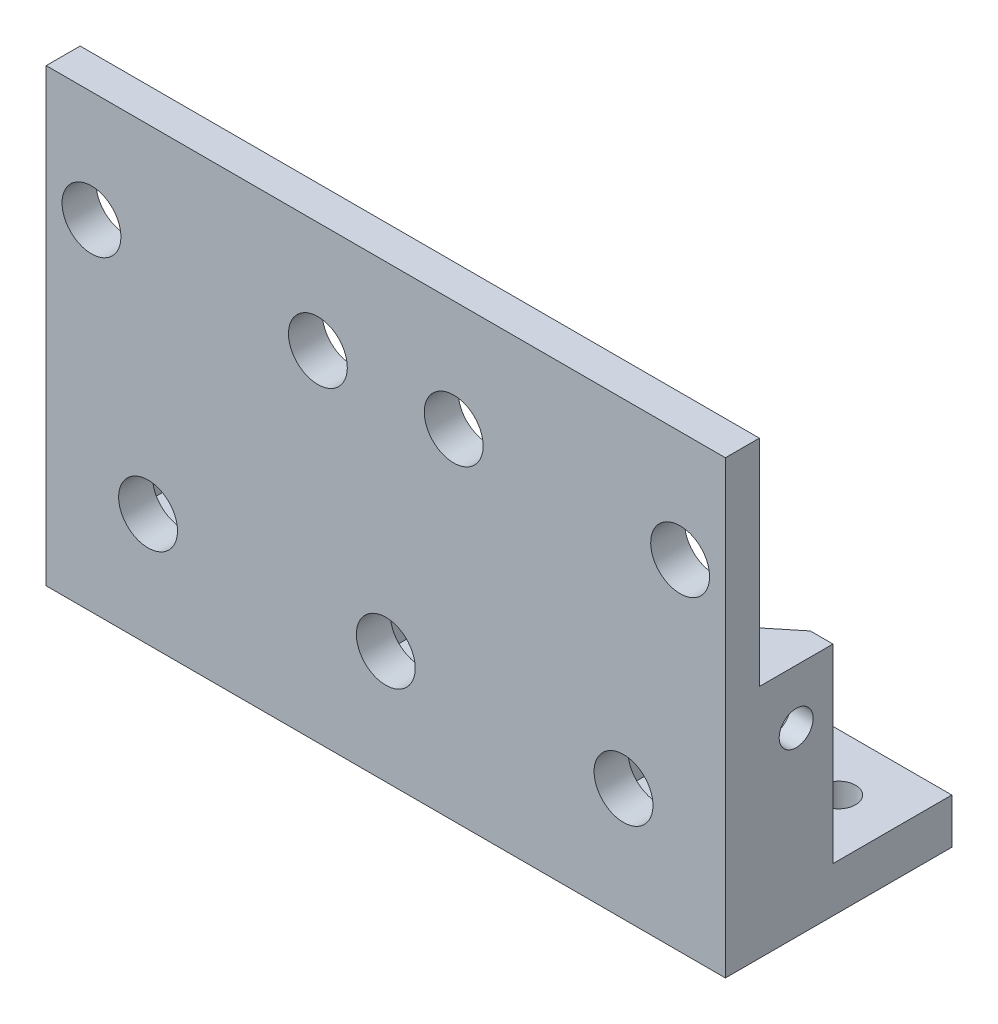
ISO-10303-21;
HEADER;
FILE_DESCRIPTION(('STEP AP214'),'2;1');
FILE_NAME('part.step','',(''),(''),'','','');
FILE_SCHEMA(('AUTOMOTIVE_DESIGN { 1 0 10303 214 1 1 1 1 }'));
ENDSEC;
DATA;
#1=APPLICATION_CONTEXT('core data for automotive mechanical design processes');
#2=APPLICATION_PROTOCOL_DEFINITION('international standard','automotive_design',2000,#1);
#3=PRODUCT_CONTEXT('',#1,'mechanical');
#4=PRODUCT('Part','Part','',(#3));
#5=PRODUCT_RELATED_PRODUCT_CATEGORY('part','',(#4));
#6=PRODUCT_DEFINITION_FORMATION('','',#4);
#7=PRODUCT_DEFINITION_CONTEXT('part definition',#1,'design');
#8=PRODUCT_DEFINITION('design','',#6,#7);
#9=PRODUCT_DEFINITION_SHAPE('','',#8);
#10=(LENGTH_UNIT() NAMED_UNIT(*) SI_UNIT(.MILLI.,.METRE.));
#11=(NAMED_UNIT(*) PLANE_ANGLE_UNIT() SI_UNIT($,.RADIAN.));
#12=(NAMED_UNIT(*) SI_UNIT($,.STERADIAN.) SOLID_ANGLE_UNIT());
#13=UNCERTAINTY_MEASURE_WITH_UNIT(LENGTH_MEASURE(1.E-05),#10,'distance_accuracy_value','');
#14=(GEOMETRIC_REPRESENTATION_CONTEXT(3) GLOBAL_UNCERTAINTY_ASSIGNED_CONTEXT((#13)) GLOBAL_UNIT_ASSIGNED_CONTEXT((#10,
#11,#12)) REPRESENTATION_CONTEXT('',''));
#15=CARTESIAN_POINT('',(0.,0.,0.));
#16=DIRECTION('',(0.,0.,1.));
#17=DIRECTION('',(1.,0.,0.));
#18=AXIS2_PLACEMENT_3D('',#15,#16,#17);
#19=CARTESIAN_POINT('',(60.,19.9,-1.5));
#20=DIRECTION('',(0.,0.,1.));
#21=DIRECTION('',(0.,-1.,0.));
#22=AXIS2_PLACEMENT_3D('',#19,#20,#21);
#23=PLANE('',#22);
#24=CARTESIAN_POINT('',(9.,-9.89999999999999,-1.5));
#25=DIRECTION('',(0.,0.,-1.));
#26=DIRECTION('',(0.,1.,0.));
#27=AXIS2_PLACEMENT_3D('',#24,#25,#26);
#28=CIRCLE('',#27,2.60000000000001);
#29=CARTESIAN_POINT('',(9.,-7.29999999999998,-1.5));
#30=VERTEX_POINT('',#29);
#31=EDGE_CURVE('E333',#30,#30,#28,.T.);
#32=ORIENTED_EDGE('',*,*,#31,.F.);
#33=EDGE_LOOP('',(#32));
#34=FACE_BOUND('',#33,.T.);
#35=CARTESIAN_POINT('',(30.,-9.89999999999999,-1.5));
#36=DIRECTION('',(0.,0.,-1.));
#37=DIRECTION('',(0.,1.,0.));
#38=AXIS2_PLACEMENT_3D('',#35,#36,#37);
#39=CIRCLE('',#38,2.60000000000001);
#40=CARTESIAN_POINT('',(30.,-7.29999999999998,-1.5));
#41=VERTEX_POINT('',#40);
#42=EDGE_CURVE('E327',#41,#41,#39,.T.);
#43=ORIENTED_EDGE('',*,*,#42,.F.);
#44=EDGE_LOOP('',(#43));
#45=FACE_BOUND('',#44,.T.);
#46=CARTESIAN_POINT('',(51.,-9.89999999999999,-1.5));
#47=DIRECTION('',(0.,0.,-1.));
#48=DIRECTION('',(0.,1.,0.));
#49=AXIS2_PLACEMENT_3D('',#46,#47,#48);
#50=CIRCLE('',#49,2.60000000000001);
#51=CARTESIAN_POINT('',(51.,-7.29999999999998,-1.5));
#52=VERTEX_POINT('',#51);
#53=EDGE_CURVE('E321',#52,#52,#50,.T.);
#54=ORIENTED_EDGE('',*,*,#53,.F.);
#55=EDGE_LOOP('',(#54));
#56=FACE_BOUND('',#55,.T.);
#57=CARTESIAN_POINT('',(4.,10.1,-1.5));
#58=DIRECTION('',(0.,0.,-1.));
#59=DIRECTION('',(0.,1.,0.));
#60=AXIS2_PLACEMENT_3D('',#57,#58,#59);
#61=CIRCLE('',#60,2.60000000000001);
#62=CARTESIAN_POINT('',(4.,12.7,-1.5));
#63=VERTEX_POINT('',#62);
#64=EDGE_CURVE('E256',#63,#63,#61,.T.);
#65=ORIENTED_EDGE('',*,*,#64,.F.);
#66=EDGE_LOOP('',(#65));
#67=FACE_BOUND('',#66,.T.);
#68=CARTESIAN_POINT('',(24.,10.1,-1.5));
#69=DIRECTION('',(0.,0.,-1.));
#70=DIRECTION('',(0.,1.,0.));
#71=AXIS2_PLACEMENT_3D('',#68,#69,#70);
#72=CIRCLE('',#71,2.60000000000001);
#73=CARTESIAN_POINT('',(24.,12.7,-1.5));
#74=VERTEX_POINT('',#73);
#75=EDGE_CURVE('E250',#74,#74,#72,.T.);
#76=ORIENTED_EDGE('',*,*,#75,.F.);
#77=EDGE_LOOP('',(#76));
#78=FACE_BOUND('',#77,.T.);
#79=CARTESIAN_POINT('',(36.,10.1,-1.5));
#80=DIRECTION('',(0.,0.,-1.));
#81=DIRECTION('',(0.,1.,0.));
#82=AXIS2_PLACEMENT_3D('',#79,#80,#81);
#83=CIRCLE('',#82,2.60000000000001);
#84=CARTESIAN_POINT('',(36.,12.7,-1.5));
#85=VERTEX_POINT('',#84);
#86=EDGE_CURVE('E244',#85,#85,#83,.T.);
#87=ORIENTED_EDGE('',*,*,#86,.F.);
#88=EDGE_LOOP('',(#87));
#89=FACE_BOUND('',#88,.T.);
#90=CARTESIAN_POINT('',(56.,10.1,-1.5));
#91=DIRECTION('',(0.,0.,-1.));
#92=DIRECTION('',(0.,1.,0.));
#93=AXIS2_PLACEMENT_3D('',#90,#91,#92);
#94=CIRCLE('',#93,2.60000000000001);
#95=CARTESIAN_POINT('',(56.,12.7,-1.5));
#96=VERTEX_POINT('',#95);
#97=EDGE_CURVE('E238',#96,#96,#94,.T.);
#98=ORIENTED_EDGE('',*,*,#97,.F.);
#99=EDGE_LOOP('',(#98));
#100=FACE_BOUND('',#99,.T.);
#101=DIRECTION('',(0.,1.,0.));
#102=VECTOR('',#101,1.);
#103=CARTESIAN_POINT('',(60.,19.9,-1.5));
#104=LINE('',#103,#102);
#105=CARTESIAN_POINT('',(60.,0.900000000000005,-1.5));
#106=VERTEX_POINT('',#105);
#107=CARTESIAN_POINT('',(60.,19.9,-1.5));
#108=VERTEX_POINT('',#107);
#109=EDGE_CURVE('E395',#106,#108,#104,.T.);
#110=ORIENTED_EDGE('',*,*,#109,.F.);
#111=DIRECTION('',(-1.,0.,0.));
#112=VECTOR('',#111,1.);
#113=CARTESIAN_POINT('',(50.,0.900000000000005,-1.49999999999999));
#114=LINE('',#113,#112);
#115=CARTESIAN_POINT('',(50.,0.900000000000005,-1.49999999999999));
#116=VERTEX_POINT('',#115);
#117=EDGE_CURVE('E203',#106,#116,#114,.T.);
#118=ORIENTED_EDGE('',*,*,#117,.T.);
#119=DIRECTION('',(0.,-1.,0.));
#120=VECTOR('',#119,1.);
#121=CARTESIAN_POINT('',(50.,0.900000000000005,-1.49999999999999));
#122=LINE('',#121,#120);
#123=CARTESIAN_POINT('',(50.,-0.899999999999995,-1.49999999999999));
#124=VERTEX_POINT('',#123);
#125=EDGE_CURVE('E214',#116,#124,#122,.T.);
#126=ORIENTED_EDGE('',*,*,#125,.T.);
#127=DIRECTION('',(-1.,0.,0.));
#128=VECTOR('',#127,1.);
#129=CARTESIAN_POINT('',(60.,-0.899999999999995,-1.5));
#130=LINE('',#129,#128);
#131=CARTESIAN_POINT('',(58.,-0.899999999999995,-1.5));
#132=VERTEX_POINT('',#131);
#133=EDGE_CURVE('E204',#132,#124,#130,.T.);
#134=ORIENTED_EDGE('',*,*,#133,.F.);
#135=DIRECTION('',(0.,1.,0.));
#136=VECTOR('',#135,1.);
#137=CARTESIAN_POINT('',(58.,-0.899999999999994,-1.5));
#138=LINE('',#137,#136);
#139=CARTESIAN_POINT('',(58.,-15.9,-1.5));
#140=VERTEX_POINT('',#139);
#141=EDGE_CURVE('E55',#140,#132,#138,.T.);
#142=ORIENTED_EDGE('',*,*,#141,.F.);
#143=DIRECTION('',(-1.,0.,0.));
#144=VECTOR('',#143,1.);
#145=CARTESIAN_POINT('',(60.,-15.9,-1.5));
#146=LINE('',#145,#144);
#147=CARTESIAN_POINT('',(45.,-15.9,-1.5));
#148=VERTEX_POINT('',#147);
#149=EDGE_CURVE('E341',#140,#148,#146,.T.);
#150=ORIENTED_EDGE('',*,*,#149,.T.);
#151=DIRECTION('',(0.,-1.,0.));
#152=VECTOR('',#151,1.);
#153=CARTESIAN_POINT('',(45.,44.1,-1.5));
#154=LINE('',#153,#152);
#155=CARTESIAN_POINT('',(45.,-0.100000000000003,-1.5));
#156=VERTEX_POINT('',#155);
#157=EDGE_CURVE('E346',#156,#148,#154,.T.);
#158=ORIENTED_EDGE('',*,*,#157,.F.);
#159=DIRECTION('',(-1.,0.,0.));
#160=VECTOR('',#159,1.);
#161=CARTESIAN_POINT('',(60.,-0.100000000000003,-1.5));
#162=LINE('',#161,#160);
#163=CARTESIAN_POINT('',(36.,-0.100000000000003,-1.5));
#164=VERTEX_POINT('',#163);
#165=EDGE_CURVE('E423',#156,#164,#162,.T.);
#166=ORIENTED_EDGE('',*,*,#165,.T.);
#167=DIRECTION('',(0.,-1.,0.));
#168=VECTOR('',#167,1.);
#169=CARTESIAN_POINT('',(36.,44.1,-1.5));
#170=LINE('',#169,#168);
#171=CARTESIAN_POINT('',(36.,-15.9,-1.5));
#172=VERTEX_POINT('',#171);
#173=EDGE_CURVE('E363',#164,#172,#170,.T.);
#174=ORIENTED_EDGE('',*,*,#173,.T.);
#175=DIRECTION('',(-1.,0.,0.));
#176=VECTOR('',#175,1.);
#177=CARTESIAN_POINT('',(36.,-15.9,-1.5));
#178=LINE('',#177,#176);
#179=CARTESIAN_POINT('',(24.,-15.9,-1.5));
#180=VERTEX_POINT('',#179);
#181=EDGE_CURVE('E365',#172,#180,#178,.T.);
#182=ORIENTED_EDGE('',*,*,#181,.T.);
#183=DIRECTION('',(0.,-1.,0.));
#184=VECTOR('',#183,1.);
#185=CARTESIAN_POINT('',(24.,44.1,-1.5));
#186=LINE('',#185,#184);
#187=CARTESIAN_POINT('',(24.,-0.100000000000003,-1.5));
#188=VERTEX_POINT('',#187);
#189=EDGE_CURVE('E339',#188,#180,#186,.T.);
#190=ORIENTED_EDGE('',*,*,#189,.F.);
#191=CARTESIAN_POINT('',(15.,-0.100000000000003,-1.5));
#192=VERTEX_POINT('',#191);
#193=EDGE_CURVE('E420',#188,#192,#162,.T.);
#194=ORIENTED_EDGE('',*,*,#193,.T.);
#195=DIRECTION('',(0.,-1.,0.));
#196=VECTOR('',#195,1.);
#197=CARTESIAN_POINT('',(15.,44.1,-1.5));
#198=LINE('',#197,#196);
#199=CARTESIAN_POINT('',(15.,-15.9,-1.5));
#200=VERTEX_POINT('',#199);
#201=EDGE_CURVE('E350',#192,#200,#198,.T.);
#202=ORIENTED_EDGE('',*,*,#201,.T.);
#203=DIRECTION('',(-1.,0.,0.));
#204=VECTOR('',#203,1.);
#205=CARTESIAN_POINT('',(0.,-15.9,-1.5));
#206=LINE('',#205,#204);
#207=CARTESIAN_POINT('',(2.,-15.9,-1.5));
#208=VERTEX_POINT('',#207);
#209=EDGE_CURVE('E352',#200,#208,#206,.T.);
#210=ORIENTED_EDGE('',*,*,#209,.T.);
#211=DIRECTION('',(0.,1.,0.));
#212=VECTOR('',#211,1.);
#213=CARTESIAN_POINT('',(2.,-0.899999999999994,-1.5));
#214=LINE('',#213,#212);
#215=CARTESIAN_POINT('',(2.,-0.899999999999994,-1.5));
#216=VERTEX_POINT('',#215);
#217=EDGE_CURVE('E291',#208,#216,#214,.T.);
#218=ORIENTED_EDGE('',*,*,#217,.T.);
#219=DIRECTION('',(1.,0.,0.));
#220=VECTOR('',#219,1.);
#221=CARTESIAN_POINT('',(10.,-0.899999999999995,-1.49999999999999));
#222=LINE('',#221,#220);
#223=CARTESIAN_POINT('',(9.99999999999998,-0.899999999999995,-1.5));
#224=VERTEX_POINT('',#223);
#225=EDGE_CURVE('E262',#216,#224,#222,.T.);
#226=ORIENTED_EDGE('',*,*,#225,.T.);
#227=DIRECTION('',(0.,-1.,0.));
#228=VECTOR('',#227,1.);
#229=CARTESIAN_POINT('',(10.,0.900000000000005,-1.49999999999999));
#230=LINE('',#229,#228);
#231=CARTESIAN_POINT('',(9.99999999999998,0.900000000000005,-1.5));
#232=VERTEX_POINT('',#231);
#233=EDGE_CURVE('E281',#232,#224,#230,.T.);
#234=ORIENTED_EDGE('',*,*,#233,.F.);
#235=DIRECTION('',(1.,0.,0.));
#236=VECTOR('',#235,1.);
#237=CARTESIAN_POINT('',(0.,0.900000000000005,-1.5));
#238=LINE('',#237,#236);
#239=CARTESIAN_POINT('',(0.,0.900000000000005,-1.5));
#240=VERTEX_POINT('',#239);
#241=EDGE_CURVE('E266',#240,#232,#238,.T.);
#242=ORIENTED_EDGE('',*,*,#241,.F.);
#243=DIRECTION('',(0.,1.,0.));
#244=VECTOR('',#243,1.);
#245=CARTESIAN_POINT('',(0.,19.9,-1.5));
#246=LINE('',#245,#244);
#247=CARTESIAN_POINT('',(0.,19.9,-1.5));
#248=VERTEX_POINT('',#247);
#249=EDGE_CURVE('E405',#240,#248,#246,.T.);
#250=ORIENTED_EDGE('',*,*,#249,.T.);
#251=DIRECTION('',(-1.,0.,0.));
#252=VECTOR('',#251,1.);
#253=CARTESIAN_POINT('',(60.,19.9,-1.5));
#254=LINE('',#253,#252);
#255=EDGE_CURVE('E417',#108,#248,#254,.T.);
#256=ORIENTED_EDGE('',*,*,#255,.F.);
#257=EDGE_LOOP('',(#110,#118,#126,#134,#142,#150,#158,#166,#174,#182,#190,#194,#202,#210,#218,
#226,#234,#242,#250,#256));
#258=FACE_BOUND('',#257,.T.);
#259=ADVANCED_FACE('F39',(#34,#45,#56,#67,#78,#89,#100,#258),#23,.F.);
#260=CARTESIAN_POINT('',(0.,-15.9,0.));
#261=DIRECTION('',(0.,-1.,0.));
#262=DIRECTION('',(0.,0.,-1.));
#263=AXIS2_PLACEMENT_3D('',#260,#261,#262);
#264=PLANE('',#263);
#265=CARTESIAN_POINT('',(55.,-15.9,-13.5));
#266=DIRECTION('',(0.,-1.,0.));
#267=DIRECTION('',(0.,0.,-1.));
#268=AXIS2_PLACEMENT_3D('',#265,#266,#267);
#269=CIRCLE('',#268,1.50000000000001);
#270=CARTESIAN_POINT('',(55.,-15.9,-15.));
#271=VERTEX_POINT('',#270);
#272=EDGE_CURVE('E309',#271,#271,#269,.T.);
#273=ORIENTED_EDGE('',*,*,#272,.T.);
#274=EDGE_LOOP('',(#273));
#275=FACE_BOUND('',#274,.T.);
#276=DIRECTION('',(0.,0.,1.));
#277=VECTOR('',#276,1.);
#278=CARTESIAN_POINT('',(58.,-15.9,-8.));
#279=LINE('',#278,#277);
#280=CARTESIAN_POINT('',(58.,-15.9,-8.));
#281=VERTEX_POINT('',#280);
#282=EDGE_CURVE('E228',#281,#140,#279,.T.);
#283=ORIENTED_EDGE('',*,*,#282,.F.);
#284=DIRECTION('',(1.,0.,0.));
#285=VECTOR('',#284,1.);
#286=CARTESIAN_POINT('',(58.,-15.9,-8.));
#287=LINE('',#286,#285);
#288=CARTESIAN_POINT('',(60.,-15.9,-8.));
#289=VERTEX_POINT('',#288);
#290=EDGE_CURVE('E63',#281,#289,#287,.T.);
#291=ORIENTED_EDGE('',*,*,#290,.T.);
#292=DIRECTION('',(0.,0.,1.));
#293=VECTOR('',#292,1.);
#294=CARTESIAN_POINT('',(60.,-15.9,-18.5));
#295=LINE('',#294,#293);
#296=CARTESIAN_POINT('',(60.,-15.9,-18.5));
#297=VERTEX_POINT('',#296);
#298=EDGE_CURVE('E191',#297,#289,#295,.T.);
#299=ORIENTED_EDGE('',*,*,#298,.F.);
#300=DIRECTION('',(-1.,0.,0.));
#301=VECTOR('',#300,1.);
#302=CARTESIAN_POINT('',(60.,-15.9,-18.5));
#303=LINE('',#302,#301);
#304=CARTESIAN_POINT('',(45.,-15.9,-18.5));
#305=VERTEX_POINT('',#304);
#306=EDGE_CURVE('E48',#297,#305,#303,.T.);
#307=ORIENTED_EDGE('',*,*,#306,.T.);
#308=DIRECTION('',(0.,0.,-1.));
#309=VECTOR('',#308,1.);
#310=CARTESIAN_POINT('',(45.,-15.9,-18.5));
#311=LINE('',#310,#309);
#312=EDGE_CURVE('E344',#148,#305,#311,.T.);
#313=ORIENTED_EDGE('',*,*,#312,.F.);
#314=ORIENTED_EDGE('',*,*,#149,.F.);
#315=EDGE_LOOP('',(#283,#291,#299,#307,#313,#314));
#316=FACE_BOUND('',#315,.T.);
#317=ADVANCED_FACE('F500',(#275,#316),#264,.F.);
#318=CARTESIAN_POINT('',(60.,-15.9,-18.5));
#319=DIRECTION('',(0.,-0.732486492845499,0.680781563938758));
#320=DIRECTION('',(0.,-0.680781563938758,-0.732486492845499));
#321=AXIS2_PLACEMENT_3D('',#318,#319,#320);
#322=PLANE('',#321);
#323=CARTESIAN_POINT('',(24.,-15.9,-18.5));
#324=VERTEX_POINT('',#323);
#325=CARTESIAN_POINT('',(15.,-15.9,-18.5));
#326=VERTEX_POINT('',#325);
#327=EDGE_CURVE('E426',#324,#326,#303,.T.);
#328=ORIENTED_EDGE('',*,*,#327,.T.);
#329=DIRECTION('',(0.,0.680781563938758,0.732486492845499));
#330=VECTOR('',#329,1.);
#331=CARTESIAN_POINT('',(15.,-15.9,-18.5));
#332=LINE('',#331,#330);
#333=EDGE_CURVE('E382',#326,#192,#332,.T.);
#334=ORIENTED_EDGE('',*,*,#333,.T.);
#335=ORIENTED_EDGE('',*,*,#193,.F.);
#336=DIRECTION('',(0.,-0.680781563938758,-0.732486492845499));
#337=VECTOR('',#336,1.);
#338=CARTESIAN_POINT('',(24.,-15.9,-18.5));
#339=LINE('',#338,#337);
#340=EDGE_CURVE('E379',#188,#324,#339,.T.);
#341=ORIENTED_EDGE('',*,*,#340,.T.);
#342=EDGE_LOOP('',(#328,#334,#335,#341));
#343=FACE_BOUND('',#342,.T.);
#344=ADVANCED_FACE('F451',(#343),#322,.F.);
#345=CARTESIAN_POINT('',(60.,-19.9,-18.5));
#346=DIRECTION('',(0.,0.,1.));
#347=DIRECTION('',(1.,0.,0.));
#348=AXIS2_PLACEMENT_3D('',#345,#346,#347);
#349=PLANE('',#348);
#350=DIRECTION('',(0.,1.,0.));
#351=VECTOR('',#350,1.);
#352=CARTESIAN_POINT('',(0.,-19.9,-18.5));
#353=LINE('',#352,#351);
#354=CARTESIAN_POINT('',(0.,-19.9,-18.5));
#355=VERTEX_POINT('',#354);
#356=CARTESIAN_POINT('',(0.,-15.9,-18.5));
#357=VERTEX_POINT('',#356);
#358=EDGE_CURVE('E388',#355,#357,#353,.T.);
#359=ORIENTED_EDGE('',*,*,#358,.T.);
#360=DIRECTION('',(1.,0.,0.));
#361=VECTOR('',#360,1.);
#362=CARTESIAN_POINT('',(0.,-15.9,-18.5));
#363=LINE('',#362,#361);
#364=EDGE_CURVE('E359',#357,#326,#363,.T.);
#365=ORIENTED_EDGE('',*,*,#364,.T.);
#366=ORIENTED_EDGE('',*,*,#327,.F.);
#367=DIRECTION('',(1.,0.,0.));
#368=VECTOR('',#367,1.);
#369=CARTESIAN_POINT('',(36.,-15.9,-18.5));
#370=LINE('',#369,#368);
#371=CARTESIAN_POINT('',(36.,-15.9,-18.5));
#372=VERTEX_POINT('',#371);
#373=EDGE_CURVE('E372',#324,#372,#370,.T.);
#374=ORIENTED_EDGE('',*,*,#373,.T.);
#375=EDGE_CURVE('E425',#305,#372,#303,.T.);
#376=ORIENTED_EDGE('',*,*,#375,.F.);
#377=ORIENTED_EDGE('',*,*,#306,.F.);
#378=DIRECTION('',(0.,1.,0.));
#379=VECTOR('',#378,1.);
#380=CARTESIAN_POINT('',(60.,-19.9,-18.5));
#381=LINE('',#380,#379);
#382=CARTESIAN_POINT('',(60.,-19.9,-18.5));
#383=VERTEX_POINT('',#382);
#384=EDGE_CURVE('E392',#383,#297,#381,.T.);
#385=ORIENTED_EDGE('',*,*,#384,.F.);
#386=DIRECTION('',(-1.,0.,0.));
#387=VECTOR('',#386,1.);
#388=CARTESIAN_POINT('',(60.,-19.9,-18.5));
#389=LINE('',#388,#387);
#390=EDGE_CURVE('E11',#383,#355,#389,.T.);
#391=ORIENTED_EDGE('',*,*,#390,.T.);
#392=EDGE_LOOP('',(#359,#365,#366,#374,#376,#377,#385,#391));
#393=FACE_BOUND('',#392,.T.);
#394=ADVANCED_FACE('F41',(#393),#349,.F.);
#395=ORIENTED_EDGE('',*,*,#165,.F.);
#396=DIRECTION('',(0.,-0.680781563938758,-0.732486492845499));
#397=VECTOR('',#396,1.);
#398=CARTESIAN_POINT('',(45.,-15.9,-18.5));
#399=LINE('',#398,#397);
#400=EDGE_CURVE('E385',#156,#305,#399,.T.);
#401=ORIENTED_EDGE('',*,*,#400,.T.);
#402=ORIENTED_EDGE('',*,*,#375,.T.);
#403=DIRECTION('',(0.,0.680781563938758,0.732486492845499));
#404=VECTOR('',#403,1.);
#405=CARTESIAN_POINT('',(36.,-15.9,-18.5));
#406=LINE('',#405,#404);
#407=EDGE_CURVE('E349',#372,#164,#406,.T.);
#408=ORIENTED_EDGE('',*,*,#407,.T.);
#409=EDGE_LOOP('',(#395,#401,#402,#408));
#410=FACE_BOUND('',#409,.T.);
#411=ADVANCED_FACE('F437',(#410),#322,.F.);
#412=CARTESIAN_POINT('',(60.,19.9,1.5));
#413=DIRECTION('',(0.,-1.,0.));
#414=DIRECTION('',(0.,0.,-1.));
#415=AXIS2_PLACEMENT_3D('',#412,#413,#414);
#416=PLANE('',#415);
#417=DIRECTION('',(0.,0.,1.));
#418=VECTOR('',#417,1.);
#419=CARTESIAN_POINT('',(0.,19.9,1.5));
#420=LINE('',#419,#418);
#421=CARTESIAN_POINT('',(0.,19.9,1.5));
#422=VERTEX_POINT('',#421);
#423=EDGE_CURVE('E407',#248,#422,#420,.T.);
#424=ORIENTED_EDGE('',*,*,#423,.T.);
#425=DIRECTION('',(-1.,0.,0.));
#426=VECTOR('',#425,1.);
#427=CARTESIAN_POINT('',(60.,19.9,1.5));
#428=LINE('',#427,#426);
#429=CARTESIAN_POINT('',(60.,19.9,1.5));
#430=VERTEX_POINT('',#429);
#431=EDGE_CURVE('E414',#430,#422,#428,.T.);
#432=ORIENTED_EDGE('',*,*,#431,.F.);
#433=DIRECTION('',(0.,0.,1.));
#434=VECTOR('',#433,1.);
#435=CARTESIAN_POINT('',(60.,19.9,1.5));
#436=LINE('',#435,#434);
#437=EDGE_CURVE('E397',#108,#430,#436,.T.);
#438=ORIENTED_EDGE('',*,*,#437,.F.);
#439=ORIENTED_EDGE('',*,*,#255,.T.);
#440=EDGE_LOOP('',(#424,#432,#438,#439));
#441=FACE_BOUND('',#440,.T.);
#442=ADVANCED_FACE('F488',(#441),#416,.F.);
#443=CARTESIAN_POINT('',(60.,19.9,1.5));
#444=DIRECTION('',(0.,0.,-1.));
#445=DIRECTION('',(0.,1.,0.));
#446=AXIS2_PLACEMENT_3D('',#443,#444,#445);
#447=PLANE('',#446);
#448=CARTESIAN_POINT('',(56.,10.1,1.5));
#449=DIRECTION('',(0.,0.,-1.));
#450=DIRECTION('',(0.,1.,0.));
#451=AXIS2_PLACEMENT_3D('',#448,#449,#450);
#452=CIRCLE('',#451,2.60000000000001);
#453=CARTESIAN_POINT('',(56.,12.7,1.5));
#454=VERTEX_POINT('',#453);
#455=EDGE_CURVE('E241',#454,#454,#452,.T.);
#456=ORIENTED_EDGE('',*,*,#455,.T.);
#457=EDGE_LOOP('',(#456));
#458=FACE_BOUND('',#457,.T.);
#459=CARTESIAN_POINT('',(36.,10.1,1.5));
#460=DIRECTION('',(0.,0.,-1.));
#461=DIRECTION('',(0.,1.,0.));
#462=AXIS2_PLACEMENT_3D('',#459,#460,#461);
#463=CIRCLE('',#462,2.60000000000001);
#464=CARTESIAN_POINT('',(36.,12.7,1.5));
#465=VERTEX_POINT('',#464);
#466=EDGE_CURVE('E247',#465,#465,#463,.T.);
#467=ORIENTED_EDGE('',*,*,#466,.T.);
#468=EDGE_LOOP('',(#467));
#469=FACE_BOUND('',#468,.T.);
#470=CARTESIAN_POINT('',(24.,10.1,1.5));
#471=DIRECTION('',(0.,0.,-1.));
#472=DIRECTION('',(0.,1.,0.));
#473=AXIS2_PLACEMENT_3D('',#470,#471,#472);
#474=CIRCLE('',#473,2.60000000000001);
#475=CARTESIAN_POINT('',(24.,12.7,1.5));
#476=VERTEX_POINT('',#475);
#477=EDGE_CURVE('E253',#476,#476,#474,.T.);
#478=ORIENTED_EDGE('',*,*,#477,.T.);
#479=EDGE_LOOP('',(#478));
#480=FACE_BOUND('',#479,.T.);
#481=CARTESIAN_POINT('',(4.,10.1,1.5));
#482=DIRECTION('',(0.,0.,-1.));
#483=DIRECTION('',(0.,1.,0.));
#484=AXIS2_PLACEMENT_3D('',#481,#482,#483);
#485=CIRCLE('',#484,2.60000000000001);
#486=CARTESIAN_POINT('',(4.,12.7,1.5));
#487=VERTEX_POINT('',#486);
#488=EDGE_CURVE('E259',#487,#487,#485,.T.);
#489=ORIENTED_EDGE('',*,*,#488,.T.);
#490=EDGE_LOOP('',(#489));
#491=FACE_BOUND('',#490,.T.);
#492=CARTESIAN_POINT('',(51.,-9.89999999999999,1.5));
#493=DIRECTION('',(0.,0.,-1.));
#494=DIRECTION('',(0.,1.,0.));
#495=AXIS2_PLACEMENT_3D('',#492,#493,#494);
#496=CIRCLE('',#495,2.60000000000001);
#497=CARTESIAN_POINT('',(51.,-7.29999999999998,1.5));
#498=VERTEX_POINT('',#497);
#499=EDGE_CURVE('E324',#498,#498,#496,.T.);
#500=ORIENTED_EDGE('',*,*,#499,.T.);
#501=EDGE_LOOP('',(#500));
#502=FACE_BOUND('',#501,.T.);
#503=CARTESIAN_POINT('',(30.,-9.89999999999999,1.5));
#504=DIRECTION('',(0.,0.,-1.));
#505=DIRECTION('',(0.,1.,0.));
#506=AXIS2_PLACEMENT_3D('',#503,#504,#505);
#507=CIRCLE('',#506,2.60000000000001);
#508=CARTESIAN_POINT('',(30.,-7.29999999999998,1.5));
#509=VERTEX_POINT('',#508);
#510=EDGE_CURVE('E330',#509,#509,#507,.T.);
#511=ORIENTED_EDGE('',*,*,#510,.T.);
#512=EDGE_LOOP('',(#511));
#513=FACE_BOUND('',#512,.T.);
#514=CARTESIAN_POINT('',(9.,-9.89999999999999,1.5));
#515=DIRECTION('',(0.,0.,-1.));
#516=DIRECTION('',(0.,1.,0.));
#517=AXIS2_PLACEMENT_3D('',#514,#515,#516);
#518=CIRCLE('',#517,2.60000000000001);
#519=CARTESIAN_POINT('',(9.,-7.29999999999998,1.5));
#520=VERTEX_POINT('',#519);
#521=EDGE_CURVE('E336',#520,#520,#518,.T.);
#522=ORIENTED_EDGE('',*,*,#521,.T.);
#523=EDGE_LOOP('',(#522));
#524=FACE_BOUND('',#523,.T.);
#525=DIRECTION('',(0.,-1.,0.));
#526=VECTOR('',#525,1.);
#527=CARTESIAN_POINT('',(0.,19.9,1.5));
#528=LINE('',#527,#526);
#529=CARTESIAN_POINT('',(0.,-19.9,1.5));
#530=VERTEX_POINT('',#529);
#531=EDGE_CURVE('E409',#422,#530,#528,.T.);
#532=ORIENTED_EDGE('',*,*,#531,.T.);
#533=DIRECTION('',(-1.,0.,0.));
#534=VECTOR('',#533,1.);
#535=CARTESIAN_POINT('',(60.,-19.9,1.5));
#536=LINE('',#535,#534);
#537=CARTESIAN_POINT('',(60.,-19.9,1.5));
#538=VERTEX_POINT('',#537);
#539=EDGE_CURVE('E402',#538,#530,#536,.T.);
#540=ORIENTED_EDGE('',*,*,#539,.F.);
#541=DIRECTION('',(0.,-1.,0.));
#542=VECTOR('',#541,1.);
#543=CARTESIAN_POINT('',(60.,19.9,1.5));
#544=LINE('',#543,#542);
#545=EDGE_CURVE('E399',#430,#538,#544,.T.);
#546=ORIENTED_EDGE('',*,*,#545,.F.);
#547=ORIENTED_EDGE('',*,*,#431,.T.);
#548=EDGE_LOOP('',(#532,#540,#546,#547));
#549=FACE_BOUND('',#548,.T.);
#550=ADVANCED_FACE('F529',(#458,#469,#480,#491,#502,#513,#524,#549),#447,.F.);
#551=CARTESIAN_POINT('',(60.,-19.9,1.5));
#552=DIRECTION('',(0.,1.,0.));
#553=DIRECTION('',(0.,0.,1.));
#554=AXIS2_PLACEMENT_3D('',#551,#552,#553);
#555=PLANE('',#554);
#556=CARTESIAN_POINT('',(55.,-19.9,-13.5));
#557=DIRECTION('',(0.,-1.,0.));
#558=DIRECTION('',(0.,0.,-1.));
#559=AXIS2_PLACEMENT_3D('',#556,#557,#558);
#560=CIRCLE('',#559,1.50000000000002);
#561=CARTESIAN_POINT('',(55.,-19.9,-15.));
#562=VERTEX_POINT('',#561);
#563=EDGE_CURVE('E306',#562,#562,#560,.T.);
#564=ORIENTED_EDGE('',*,*,#563,.F.);
#565=EDGE_LOOP('',(#564));
#566=FACE_BOUND('',#565,.T.);
#567=CARTESIAN_POINT('',(30.,-19.9,-13.5));
#568=DIRECTION('',(0.,-1.,0.));
#569=DIRECTION('',(0.,0.,-1.));
#570=AXIS2_PLACEMENT_3D('',#567,#568,#569);
#571=CIRCLE('',#570,1.50000000000002);
#572=CARTESIAN_POINT('',(30.,-19.9,-15.));
#573=VERTEX_POINT('',#572);
#574=EDGE_CURVE('E312',#573,#573,#571,.T.);
#575=ORIENTED_EDGE('',*,*,#574,.F.);
#576=EDGE_LOOP('',(#575));
#577=FACE_BOUND('',#576,.T.);
#578=CARTESIAN_POINT('',(5.,-19.9,-13.5));
#579=DIRECTION('',(0.,-1.,0.));
#580=DIRECTION('',(0.,0.,-1.));
#581=AXIS2_PLACEMENT_3D('',#578,#579,#580);
#582=CIRCLE('',#581,1.50000000000001);
#583=CARTESIAN_POINT('',(5.,-19.9,-15.));
#584=VERTEX_POINT('',#583);
#585=EDGE_CURVE('E318',#584,#584,#582,.T.);
#586=ORIENTED_EDGE('',*,*,#585,.F.);
#587=EDGE_LOOP('',(#586));
#588=FACE_BOUND('',#587,.T.);
#589=DIRECTION('',(0.,0.,-1.));
#590=VECTOR('',#589,1.);
#591=CARTESIAN_POINT('',(0.,-19.9,1.5));
#592=LINE('',#591,#590);
#593=EDGE_CURVE('E393',#530,#355,#592,.T.);
#594=ORIENTED_EDGE('',*,*,#593,.T.);
#595=ORIENTED_EDGE('',*,*,#390,.F.);
#596=DIRECTION('',(0.,0.,-1.));
#597=VECTOR('',#596,1.);
#598=CARTESIAN_POINT('',(60.,-19.9,-1.5));
#599=LINE('',#598,#597);
#600=EDGE_CURVE('E389',#538,#383,#599,.T.);
#601=ORIENTED_EDGE('',*,*,#600,.F.);
#602=ORIENTED_EDGE('',*,*,#539,.T.);
#603=EDGE_LOOP('',(#594,#595,#601,#602));
#604=FACE_BOUND('',#603,.T.);
#605=ADVANCED_FACE('F629',(#566,#577,#588,#604),#555,.F.);
#606=CARTESIAN_POINT('',(60.,0.,0.));
#607=DIRECTION('',(1.,0.,0.));
#608=DIRECTION('',(0.,0.,-1.));
#609=AXIS2_PLACEMENT_3D('',#606,#607,#608);
#610=PLANE('',#609);
#611=DIRECTION('',(0.,0.,1.));
#612=VECTOR('',#611,1.);
#613=CARTESIAN_POINT('',(60.,0.900000000000002,-8.));
#614=LINE('',#613,#612);
#615=CARTESIAN_POINT('',(60.,0.900000000000002,-8.));
#616=VERTEX_POINT('',#615);
#617=EDGE_CURVE('E188',#616,#106,#614,.T.);
#618=ORIENTED_EDGE('',*,*,#617,.T.);
#619=ORIENTED_EDGE('',*,*,#109,.T.);
#620=ORIENTED_EDGE('',*,*,#437,.T.);
#621=ORIENTED_EDGE('',*,*,#545,.T.);
#622=ORIENTED_EDGE('',*,*,#600,.T.);
#623=ORIENTED_EDGE('',*,*,#384,.T.);
#624=ORIENTED_EDGE('',*,*,#298,.T.);
#625=DIRECTION('',(0.,-1.,0.));
#626=VECTOR('',#625,1.);
#627=CARTESIAN_POINT('',(60.,-0.899999999999996,-8.));
#628=LINE('',#627,#626);
#629=EDGE_CURVE('E184',#616,#289,#628,.T.);
#630=ORIENTED_EDGE('',*,*,#629,.F.);
#631=EDGE_LOOP('',(#618,#619,#620,#621,#622,#623,#624,#630));
#632=FACE_BOUND('',#631,.T.);
#633=CARTESIAN_POINT('',(60.,-3.9,-4.75));
#634=DIRECTION('',(-1.,0.,0.));
#635=DIRECTION('',(0.,0.,1.));
#636=AXIS2_PLACEMENT_3D('',#633,#634,#635);
#637=CIRCLE('',#636,1.5);
#638=CARTESIAN_POINT('',(60.,-3.9,-3.25));
#639=VERTEX_POINT('',#638);
#640=EDGE_CURVE('E222',#639,#639,#637,.T.);
#641=ORIENTED_EDGE('',*,*,#640,.T.);
#642=EDGE_LOOP('',(#641));
#643=FACE_BOUND('',#642,.T.);
#644=ADVANCED_FACE('F186',(#632,#643),#610,.T.);
#645=CARTESIAN_POINT('',(0.,0.,0.));
#646=DIRECTION('',(1.,0.,0.));
#647=DIRECTION('',(0.,0.,-1.));
#648=AXIS2_PLACEMENT_3D('',#645,#646,#647);
#649=PLANE('',#648);
#650=ORIENTED_EDGE('',*,*,#249,.F.);
#651=DIRECTION('',(0.,0.,1.));
#652=VECTOR('',#651,1.);
#653=CARTESIAN_POINT('',(0.,0.900000000000002,-8.));
#654=LINE('',#653,#652);
#655=CARTESIAN_POINT('',(0.,0.900000000000002,-8.));
#656=VERTEX_POINT('',#655);
#657=EDGE_CURVE('E263',#656,#240,#654,.T.);
#658=ORIENTED_EDGE('',*,*,#657,.F.);
#659=DIRECTION('',(0.,-1.,0.));
#660=VECTOR('',#659,1.);
#661=CARTESIAN_POINT('',(0.,-6.9,-8.));
#662=LINE('',#661,#660);
#663=CARTESIAN_POINT('',(0.,-15.9,-8.));
#664=VERTEX_POINT('',#663);
#665=EDGE_CURVE('E288',#656,#664,#662,.T.);
#666=ORIENTED_EDGE('',*,*,#665,.T.);
#667=DIRECTION('',(0.,0.,-1.));
#668=VECTOR('',#667,1.);
#669=CARTESIAN_POINT('',(0.,-15.9,-18.5));
#670=LINE('',#669,#668);
#671=EDGE_CURVE('E342',#664,#357,#670,.T.);
#672=ORIENTED_EDGE('',*,*,#671,.T.);
#673=ORIENTED_EDGE('',*,*,#358,.F.);
#674=ORIENTED_EDGE('',*,*,#593,.F.);
#675=ORIENTED_EDGE('',*,*,#531,.F.);
#676=ORIENTED_EDGE('',*,*,#423,.F.);
#677=EDGE_LOOP('',(#650,#658,#666,#672,#673,#674,#675,#676));
#678=FACE_BOUND('',#677,.T.);
#679=CARTESIAN_POINT('',(0.,-3.9,-4.75));
#680=DIRECTION('',(-1.,0.,0.));
#681=DIRECTION('',(0.,0.,1.));
#682=AXIS2_PLACEMENT_3D('',#679,#680,#681);
#683=CIRCLE('',#682,1.5);
#684=CARTESIAN_POINT('',(0.,-3.9,-3.25));
#685=VERTEX_POINT('',#684);
#686=EDGE_CURVE('E284',#685,#685,#683,.T.);
#687=ORIENTED_EDGE('',*,*,#686,.F.);
#688=EDGE_LOOP('',(#687));
#689=FACE_BOUND('',#688,.T.);
#690=ADVANCED_FACE('F481',(#678,#689),#649,.F.);
#691=CARTESIAN_POINT('',(15.,44.1,-18.5));
#692=DIRECTION('',(1.,0.,0.));
#693=DIRECTION('',(0.,0.,-1.));
#694=AXIS2_PLACEMENT_3D('',#691,#692,#693);
#695=PLANE('',#694);
#696=DIRECTION('',(0.,0.,1.));
#697=VECTOR('',#696,1.);
#698=CARTESIAN_POINT('',(15.,-15.9,-18.5));
#699=LINE('',#698,#697);
#700=EDGE_CURVE('E356',#326,#200,#699,.T.);
#701=ORIENTED_EDGE('',*,*,#700,.T.);
#702=ORIENTED_EDGE('',*,*,#201,.F.);
#703=ORIENTED_EDGE('',*,*,#333,.F.);
#704=EDGE_LOOP('',(#701,#702,#703));
#705=FACE_BOUND('',#704,.T.);
#706=ADVANCED_FACE('F455',(#705),#695,.F.);
#707=CARTESIAN_POINT('',(0.,-15.9,0.));
#708=DIRECTION('',(0.,1.,0.));
#709=DIRECTION('',(0.,0.,1.));
#710=AXIS2_PLACEMENT_3D('',#707,#708,#709);
#711=PLANE('',#710);
#712=DIRECTION('',(-1.,0.,0.));
#713=VECTOR('',#712,1.);
#714=CARTESIAN_POINT('',(2.,-15.9,-8.));
#715=LINE('',#714,#713);
#716=CARTESIAN_POINT('',(2.,-15.9,-8.));
#717=VERTEX_POINT('',#716);
#718=EDGE_CURVE('E302',#717,#664,#715,.T.);
#719=ORIENTED_EDGE('',*,*,#718,.F.);
#720=DIRECTION('',(0.,0.,1.));
#721=VECTOR('',#720,1.);
#722=CARTESIAN_POINT('',(2.,-15.9,-8.));
#723=LINE('',#722,#721);
#724=EDGE_CURVE('E299',#717,#208,#723,.T.);
#725=ORIENTED_EDGE('',*,*,#724,.T.);
#726=ORIENTED_EDGE('',*,*,#209,.F.);
#727=ORIENTED_EDGE('',*,*,#700,.F.);
#728=ORIENTED_EDGE('',*,*,#364,.F.);
#729=ORIENTED_EDGE('',*,*,#671,.F.);
#730=EDGE_LOOP('',(#719,#725,#726,#727,#728,#729));
#731=FACE_BOUND('',#730,.T.);
#732=CARTESIAN_POINT('',(5.,-15.9,-13.5));
#733=DIRECTION('',(0.,1.,0.));
#734=DIRECTION('',(0.,0.,1.));
#735=AXIS2_PLACEMENT_3D('',#732,#733,#734);
#736=CIRCLE('',#735,1.50000000000001);
#737=CARTESIAN_POINT('',(5.,-15.9,-12.));
#738=VERTEX_POINT('',#737);
#739=EDGE_CURVE('E43',#738,#738,#736,.T.);
#740=ORIENTED_EDGE('',*,*,#739,.F.);
#741=EDGE_LOOP('',(#740));
#742=FACE_BOUND('',#741,.T.);
#743=ADVANCED_FACE('F459',(#731,#742),#711,.T.);
#744=CARTESIAN_POINT('',(45.,44.1,-18.5));
#745=DIRECTION('',(-1.,0.,0.));
#746=DIRECTION('',(0.,0.,1.));
#747=AXIS2_PLACEMENT_3D('',#744,#745,#746);
#748=PLANE('',#747);
#749=ORIENTED_EDGE('',*,*,#157,.T.);
#750=ORIENTED_EDGE('',*,*,#312,.T.);
#751=ORIENTED_EDGE('',*,*,#400,.F.);
#752=EDGE_LOOP('',(#749,#750,#751));
#753=FACE_BOUND('',#752,.T.);
#754=ADVANCED_FACE('F502',(#753),#748,.F.);
#755=CARTESIAN_POINT('',(24.,44.1,-1.5));
#756=DIRECTION('',(-1.,0.,0.));
#757=DIRECTION('',(0.,0.,1.));
#758=AXIS2_PLACEMENT_3D('',#755,#756,#757);
#759=PLANE('',#758);
#760=ORIENTED_EDGE('',*,*,#189,.T.);
#761=DIRECTION('',(0.,0.,-1.));
#762=VECTOR('',#761,1.);
#763=CARTESIAN_POINT('',(24.,-15.9,-1.5));
#764=LINE('',#763,#762);
#765=EDGE_CURVE('E353',#180,#324,#764,.T.);
#766=ORIENTED_EDGE('',*,*,#765,.T.);
#767=ORIENTED_EDGE('',*,*,#340,.F.);
#768=EDGE_LOOP('',(#760,#766,#767));
#769=FACE_BOUND('',#768,.T.);
#770=ADVANCED_FACE('F448',(#769),#759,.F.);
#771=CARTESIAN_POINT('',(36.,44.1,-1.5));
#772=DIRECTION('',(1.,0.,0.));
#773=DIRECTION('',(0.,0.,-1.));
#774=AXIS2_PLACEMENT_3D('',#771,#772,#773);
#775=PLANE('',#774);
#776=DIRECTION('',(0.,0.,1.));
#777=VECTOR('',#776,1.);
#778=CARTESIAN_POINT('',(36.,-15.9,-1.5));
#779=LINE('',#778,#777);
#780=EDGE_CURVE('E369',#372,#172,#779,.T.);
#781=ORIENTED_EDGE('',*,*,#780,.T.);
#782=ORIENTED_EDGE('',*,*,#173,.F.);
#783=ORIENTED_EDGE('',*,*,#407,.F.);
#784=EDGE_LOOP('',(#781,#782,#783));
#785=FACE_BOUND('',#784,.T.);
#786=ADVANCED_FACE('F441',(#785),#775,.F.);
#787=CARTESIAN_POINT('',(0.,-15.9,0.));
#788=DIRECTION('',(0.,1.,0.));
#789=DIRECTION('',(0.,0.,1.));
#790=AXIS2_PLACEMENT_3D('',#787,#788,#789);
#791=PLANE('',#790);
#792=CARTESIAN_POINT('',(30.,-15.9,-13.5));
#793=DIRECTION('',(0.,1.,0.));
#794=DIRECTION('',(0.,0.,1.));
#795=AXIS2_PLACEMENT_3D('',#792,#793,#794);
#796=CIRCLE('',#795,1.50000000000001);
#797=CARTESIAN_POINT('',(30.,-15.9,-12.));
#798=VERTEX_POINT('',#797);
#799=EDGE_CURVE('E315',#798,#798,#796,.T.);
#800=ORIENTED_EDGE('',*,*,#799,.F.);
#801=EDGE_LOOP('',(#800));
#802=FACE_BOUND('',#801,.T.);
#803=ORIENTED_EDGE('',*,*,#765,.F.);
#804=ORIENTED_EDGE('',*,*,#181,.F.);
#805=ORIENTED_EDGE('',*,*,#780,.F.);
#806=ORIENTED_EDGE('',*,*,#373,.F.);
#807=EDGE_LOOP('',(#803,#804,#805,#806));
#808=FACE_BOUND('',#807,.T.);
#809=ADVANCED_FACE('F446',(#802,#808),#791,.T.);
#810=CARTESIAN_POINT('',(9.,-9.89999999999999,-1.5));
#811=DIRECTION('',(0.,0.,-1.));
#812=DIRECTION('',(0.,1.,0.));
#813=AXIS2_PLACEMENT_3D('',#810,#811,#812);
#814=CYLINDRICAL_SURFACE('',#813,2.60000000000001);
#815=ORIENTED_EDGE('',*,*,#521,.F.);
#816=EDGE_LOOP('',(#815));
#817=FACE_BOUND('',#816,.T.);
#818=ORIENTED_EDGE('',*,*,#31,.T.);
#819=EDGE_LOOP('',(#818));
#820=FACE_BOUND('',#819,.T.);
#821=ADVANCED_FACE('F593',(#817,#820),#814,.F.);
#822=CARTESIAN_POINT('',(30.,-9.89999999999999,-1.5));
#823=DIRECTION('',(0.,0.,-1.));
#824=DIRECTION('',(0.,1.,0.));
#825=AXIS2_PLACEMENT_3D('',#822,#823,#824);
#826=CYLINDRICAL_SURFACE('',#825,2.60000000000001);
#827=ORIENTED_EDGE('',*,*,#510,.F.);
#828=EDGE_LOOP('',(#827));
#829=FACE_BOUND('',#828,.T.);
#830=ORIENTED_EDGE('',*,*,#42,.T.);
#831=EDGE_LOOP('',(#830));
#832=FACE_BOUND('',#831,.T.);
#833=ADVANCED_FACE('F598',(#829,#832),#826,.F.);
#834=CARTESIAN_POINT('',(51.,-9.89999999999999,-1.5));
#835=DIRECTION('',(0.,0.,-1.));
#836=DIRECTION('',(0.,1.,0.));
#837=AXIS2_PLACEMENT_3D('',#834,#835,#836);
#838=CYLINDRICAL_SURFACE('',#837,2.60000000000001);
#839=ORIENTED_EDGE('',*,*,#499,.F.);
#840=EDGE_LOOP('',(#839));
#841=FACE_BOUND('',#840,.T.);
#842=ORIENTED_EDGE('',*,*,#53,.T.);
#843=EDGE_LOOP('',(#842));
#844=FACE_BOUND('',#843,.T.);
#845=ADVANCED_FACE('F609',(#841,#844),#838,.F.);
#846=CARTESIAN_POINT('',(5.,-19.9,-13.5));
#847=DIRECTION('',(0.,-1.,0.));
#848=DIRECTION('',(0.,0.,-1.));
#849=AXIS2_PLACEMENT_3D('',#846,#847,#848);
#850=CYLINDRICAL_SURFACE('',#849,1.50000000000001);
#851=ORIENTED_EDGE('',*,*,#739,.T.);
#852=EDGE_LOOP('',(#851));
#853=FACE_BOUND('',#852,.T.);
#854=ORIENTED_EDGE('',*,*,#585,.T.);
#855=EDGE_LOOP('',(#854));
#856=FACE_BOUND('',#855,.T.);
#857=ADVANCED_FACE('F620',(#853,#856),#850,.F.);
#858=CARTESIAN_POINT('',(30.,-19.9,-13.5));
#859=DIRECTION('',(0.,-1.,0.));
#860=DIRECTION('',(0.,0.,-1.));
#861=AXIS2_PLACEMENT_3D('',#858,#859,#860);
#862=CYLINDRICAL_SURFACE('',#861,1.50000000000001);
#863=ORIENTED_EDGE('',*,*,#799,.T.);
#864=EDGE_LOOP('',(#863));
#865=FACE_BOUND('',#864,.T.);
#866=ORIENTED_EDGE('',*,*,#574,.T.);
#867=EDGE_LOOP('',(#866));
#868=FACE_BOUND('',#867,.T.);
#869=ADVANCED_FACE('F652',(#865,#868),#862,.F.);
#870=CARTESIAN_POINT('',(55.,-19.9,-13.5));
#871=DIRECTION('',(0.,-1.,0.));
#872=DIRECTION('',(0.,0.,-1.));
#873=AXIS2_PLACEMENT_3D('',#870,#871,#872);
#874=CYLINDRICAL_SURFACE('',#873,1.50000000000001);
#875=ORIENTED_EDGE('',*,*,#563,.T.);
#876=EDGE_LOOP('',(#875));
#877=FACE_BOUND('',#876,.T.);
#878=ORIENTED_EDGE('',*,*,#272,.F.);
#879=EDGE_LOOP('',(#878));
#880=FACE_BOUND('',#879,.T.);
#881=ADVANCED_FACE('F663',(#877,#880),#874,.F.);
#882=CARTESIAN_POINT('',(2.,-6.9,-8.));
#883=DIRECTION('',(0.,0.,-1.));
#884=DIRECTION('',(-1.,0.,0.));
#885=AXIS2_PLACEMENT_3D('',#882,#883,#884);
#886=PLANE('',#885);
#887=ORIENTED_EDGE('',*,*,#665,.F.);
#888=DIRECTION('',(-1.,0.,0.));
#889=VECTOR('',#888,1.);
#890=CARTESIAN_POINT('',(0.,0.900000000000002,-8.));
#891=LINE('',#890,#889);
#892=CARTESIAN_POINT('',(2.,0.900000000000002,-8.));
#893=VERTEX_POINT('',#892);
#894=EDGE_CURVE('E272',#893,#656,#891,.T.);
#895=ORIENTED_EDGE('',*,*,#894,.F.);
#896=DIRECTION('',(0.,-1.,0.));
#897=VECTOR('',#896,1.);
#898=CARTESIAN_POINT('',(2.,0.900000000000002,-8.));
#899=LINE('',#898,#897);
#900=CARTESIAN_POINT('',(2.,-0.899999999999998,-8.));
#901=VERTEX_POINT('',#900);
#902=EDGE_CURVE('E275',#893,#901,#899,.T.);
#903=ORIENTED_EDGE('',*,*,#902,.T.);
#904=DIRECTION('',(0.,-1.,0.));
#905=VECTOR('',#904,1.);
#906=CARTESIAN_POINT('',(2.,-0.899999999999996,-8.));
#907=LINE('',#906,#905);
#908=EDGE_CURVE('E297',#901,#717,#907,.T.);
#909=ORIENTED_EDGE('',*,*,#908,.T.);
#910=ORIENTED_EDGE('',*,*,#718,.T.);
#911=EDGE_LOOP('',(#887,#895,#903,#909,#910));
#912=FACE_BOUND('',#911,.T.);
#913=ADVANCED_FACE('F475',(#912),#886,.T.);
#914=CARTESIAN_POINT('',(2.,0.,0.));
#915=DIRECTION('',(-1.,0.,0.));
#916=DIRECTION('',(0.,0.,1.));
#917=AXIS2_PLACEMENT_3D('',#914,#915,#916);
#918=PLANE('',#917);
#919=CARTESIAN_POINT('',(2.,-3.9,-4.75));
#920=DIRECTION('',(-1.,0.,0.));
#921=DIRECTION('',(0.,0.,1.));
#922=AXIS2_PLACEMENT_3D('',#919,#920,#921);
#923=CIRCLE('',#922,1.5);
#924=CARTESIAN_POINT('',(2.,-3.9,-3.25));
#925=VERTEX_POINT('',#924);
#926=EDGE_CURVE('E285',#925,#925,#923,.T.);
#927=ORIENTED_EDGE('',*,*,#926,.T.);
#928=EDGE_LOOP('',(#927));
#929=FACE_BOUND('',#928,.T.);
#930=ORIENTED_EDGE('',*,*,#217,.F.);
#931=ORIENTED_EDGE('',*,*,#724,.F.);
#932=ORIENTED_EDGE('',*,*,#908,.F.);
#933=DIRECTION('',(0.,0.,-1.));
#934=VECTOR('',#933,1.);
#935=CARTESIAN_POINT('',(2.,-0.899999999999994,-1.5));
#936=LINE('',#935,#934);
#937=EDGE_CURVE('E294',#216,#901,#936,.T.);
#938=ORIENTED_EDGE('',*,*,#937,.F.);
#939=EDGE_LOOP('',(#930,#931,#932,#938));
#940=FACE_BOUND('',#939,.T.);
#941=ADVANCED_FACE('F464',(#929,#940),#918,.F.);
#942=CARTESIAN_POINT('',(2.,-3.9,-4.75));
#943=DIRECTION('',(-1.,0.,0.));
#944=DIRECTION('',(0.,0.,1.));
#945=AXIS2_PLACEMENT_3D('',#942,#943,#944);
#946=CYLINDRICAL_SURFACE('',#945,1.5);
#947=ORIENTED_EDGE('',*,*,#926,.F.);
#948=EDGE_LOOP('',(#947));
#949=FACE_BOUND('',#948,.T.);
#950=ORIENTED_EDGE('',*,*,#686,.T.);
#951=EDGE_LOOP('',(#950));
#952=FACE_BOUND('',#951,.T.);
#953=ADVANCED_FACE('F688',(#949,#952),#946,.F.);
#954=CARTESIAN_POINT('',(0.,-0.899999999999994,0.));
#955=DIRECTION('',(0.,1.,0.));
#956=DIRECTION('',(0.,0.,1.));
#957=AXIS2_PLACEMENT_3D('',#954,#955,#956);
#958=PLANE('',#957);
#959=ORIENTED_EDGE('',*,*,#225,.F.);
#960=ORIENTED_EDGE('',*,*,#937,.T.);
#961=DIRECTION('',(-0.776114000116265,0.,-0.630592625094466));
#962=VECTOR('',#961,1.);
#963=CARTESIAN_POINT('',(2.,-0.899999999999998,-8.));
#964=LINE('',#963,#962);
#965=EDGE_CURVE('E267',#224,#901,#964,.T.);
#966=ORIENTED_EDGE('',*,*,#965,.F.);
#967=EDGE_LOOP('',(#959,#960,#966));
#968=FACE_BOUND('',#967,.T.);
#969=ADVANCED_FACE('F468',(#968),#958,.F.);
#970=CARTESIAN_POINT('',(2.,0.900000000000002,-8.));
#971=DIRECTION('',(-0.630592625094466,0.,0.776114000116265));
#972=DIRECTION('',(0.776114000116265,0.,0.630592625094466));
#973=AXIS2_PLACEMENT_3D('',#970,#971,#972);
#974=PLANE('',#973);
#975=ORIENTED_EDGE('',*,*,#965,.T.);
#976=ORIENTED_EDGE('',*,*,#902,.F.);
#977=DIRECTION('',(-0.776114000116265,0.,-0.630592625094466));
#978=VECTOR('',#977,1.);
#979=CARTESIAN_POINT('',(2.,0.900000000000002,-8.));
#980=LINE('',#979,#978);
#981=EDGE_CURVE('E270',#232,#893,#980,.T.);
#982=ORIENTED_EDGE('',*,*,#981,.F.);
#983=ORIENTED_EDGE('',*,*,#233,.T.);
#984=EDGE_LOOP('',(#975,#976,#982,#983));
#985=FACE_BOUND('',#984,.T.);
#986=ADVANCED_FACE('F471',(#985),#974,.F.);
#987=CARTESIAN_POINT('',(0.,0.900000000000006,0.));
#988=DIRECTION('',(0.,1.,0.));
#989=DIRECTION('',(0.,0.,1.));
#990=AXIS2_PLACEMENT_3D('',#987,#988,#989);
#991=PLANE('',#990);
#992=ORIENTED_EDGE('',*,*,#657,.T.);
#993=ORIENTED_EDGE('',*,*,#241,.T.);
#994=ORIENTED_EDGE('',*,*,#981,.T.);
#995=ORIENTED_EDGE('',*,*,#894,.T.);
#996=EDGE_LOOP('',(#992,#993,#994,#995));
#997=FACE_BOUND('',#996,.T.);
#998=ADVANCED_FACE('F478',(#997),#991,.T.);
#999=CARTESIAN_POINT('',(4.,10.1,-1.5));
#1000=DIRECTION('',(0.,0.,-1.));
#1001=DIRECTION('',(0.,1.,0.));
#1002=AXIS2_PLACEMENT_3D('',#999,#1000,#1001);
#1003=CYLINDRICAL_SURFACE('',#1002,2.60000000000001);
#1004=ORIENTED_EDGE('',*,*,#488,.F.);
#1005=EDGE_LOOP('',(#1004));
#1006=FACE_BOUND('',#1005,.T.);
#1007=ORIENTED_EDGE('',*,*,#64,.T.);
#1008=EDGE_LOOP('',(#1007));
#1009=FACE_BOUND('',#1008,.T.);
#1010=ADVANCED_FACE('F746',(#1006,#1009),#1003,.F.);
#1011=CARTESIAN_POINT('',(24.,10.1,-1.5));
#1012=DIRECTION('',(0.,0.,-1.));
#1013=DIRECTION('',(0.,1.,0.));
#1014=AXIS2_PLACEMENT_3D('',#1011,#1012,#1013);
#1015=CYLINDRICAL_SURFACE('',#1014,2.60000000000001);
#1016=ORIENTED_EDGE('',*,*,#477,.F.);
#1017=EDGE_LOOP('',(#1016));
#1018=FACE_BOUND('',#1017,.T.);
#1019=ORIENTED_EDGE('',*,*,#75,.T.);
#1020=EDGE_LOOP('',(#1019));
#1021=FACE_BOUND('',#1020,.T.);
#1022=ADVANCED_FACE('F763',(#1018,#1021),#1015,.F.);
#1023=CARTESIAN_POINT('',(36.,10.1,-1.5));
#1024=DIRECTION('',(0.,0.,-1.));
#1025=DIRECTION('',(0.,1.,0.));
#1026=AXIS2_PLACEMENT_3D('',#1023,#1024,#1025);
#1027=CYLINDRICAL_SURFACE('',#1026,2.60000000000001);
#1028=ORIENTED_EDGE('',*,*,#466,.F.);
#1029=EDGE_LOOP('',(#1028));
#1030=FACE_BOUND('',#1029,.T.);
#1031=ORIENTED_EDGE('',*,*,#86,.T.);
#1032=EDGE_LOOP('',(#1031));
#1033=FACE_BOUND('',#1032,.T.);
#1034=ADVANCED_FACE('F774',(#1030,#1033),#1027,.F.);
#1035=CARTESIAN_POINT('',(56.,10.1,-1.5));
#1036=DIRECTION('',(0.,0.,-1.));
#1037=DIRECTION('',(0.,1.,0.));
#1038=AXIS2_PLACEMENT_3D('',#1035,#1036,#1037);
#1039=CYLINDRICAL_SURFACE('',#1038,2.60000000000001);
#1040=ORIENTED_EDGE('',*,*,#455,.F.);
#1041=EDGE_LOOP('',(#1040));
#1042=FACE_BOUND('',#1041,.T.);
#1043=ORIENTED_EDGE('',*,*,#97,.T.);
#1044=EDGE_LOOP('',(#1043));
#1045=FACE_BOUND('',#1044,.T.);
#1046=ADVANCED_FACE('F785',(#1042,#1045),#1039,.F.);
#1047=CARTESIAN_POINT('',(58.,0.,0.));
#1048=DIRECTION('',(1.,0.,0.));
#1049=DIRECTION('',(0.,0.,1.));
#1050=AXIS2_PLACEMENT_3D('',#1047,#1048,#1049);
#1051=PLANE('',#1050);
#1052=ORIENTED_EDGE('',*,*,#141,.T.);
#1053=DIRECTION('',(0.,0.,-1.));
#1054=VECTOR('',#1053,1.);
#1055=CARTESIAN_POINT('',(58.,-0.899999999999994,-1.5));
#1056=LINE('',#1055,#1054);
#1057=CARTESIAN_POINT('',(58.,-0.899999999999998,-8.));
#1058=VERTEX_POINT('',#1057);
#1059=EDGE_CURVE('E234',#132,#1058,#1056,.T.);
#1060=ORIENTED_EDGE('',*,*,#1059,.T.);
#1061=DIRECTION('',(0.,-1.,0.));
#1062=VECTOR('',#1061,1.);
#1063=CARTESIAN_POINT('',(58.,-6.9,-8.));
#1064=LINE('',#1063,#1062);
#1065=EDGE_CURVE('E231',#1058,#281,#1064,.T.);
#1066=ORIENTED_EDGE('',*,*,#1065,.T.);
#1067=ORIENTED_EDGE('',*,*,#282,.T.);
#1068=EDGE_LOOP('',(#1052,#1060,#1066,#1067));
#1069=FACE_BOUND('',#1068,.T.);
#1070=CARTESIAN_POINT('',(58.,-3.9,-4.75));
#1071=DIRECTION('',(-1.,0.,0.));
#1072=DIRECTION('',(0.,0.,1.));
#1073=AXIS2_PLACEMENT_3D('',#1070,#1071,#1072);
#1074=CIRCLE('',#1073,1.5);
#1075=CARTESIAN_POINT('',(58.,-3.9,-3.25));
#1076=VERTEX_POINT('',#1075);
#1077=EDGE_CURVE('E194',#1076,#1076,#1074,.T.);
#1078=ORIENTED_EDGE('',*,*,#1077,.F.);
#1079=EDGE_LOOP('',(#1078));
#1080=FACE_BOUND('',#1079,.T.);
#1081=ADVANCED_FACE('F498',(#1069,#1080),#1051,.F.);
#1082=CARTESIAN_POINT('',(58.,-0.899999999999996,-8.));
#1083=DIRECTION('',(0.,0.,1.));
#1084=DIRECTION('',(1.,0.,0.));
#1085=AXIS2_PLACEMENT_3D('',#1082,#1083,#1084);
#1086=PLANE('',#1085);
#1087=ORIENTED_EDGE('',*,*,#629,.T.);
#1088=ORIENTED_EDGE('',*,*,#290,.F.);
#1089=ORIENTED_EDGE('',*,*,#1065,.F.);
#1090=DIRECTION('',(0.,-1.,0.));
#1091=VECTOR('',#1090,1.);
#1092=CARTESIAN_POINT('',(58.,0.900000000000002,-8.));
#1093=LINE('',#1092,#1091);
#1094=CARTESIAN_POINT('',(58.,0.900000000000002,-8.));
#1095=VERTEX_POINT('',#1094);
#1096=EDGE_CURVE('E208',#1095,#1058,#1093,.T.);
#1097=ORIENTED_EDGE('',*,*,#1096,.F.);
#1098=DIRECTION('',(1.,0.,0.));
#1099=VECTOR('',#1098,1.);
#1100=CARTESIAN_POINT('',(60.,0.900000000000002,-8.));
#1101=LINE('',#1100,#1099);
#1102=EDGE_CURVE('E200',#1095,#616,#1101,.T.);
#1103=ORIENTED_EDGE('',*,*,#1102,.T.);
#1104=EDGE_LOOP('',(#1087,#1088,#1089,#1097,#1103));
#1105=FACE_BOUND('',#1104,.T.);
#1106=ADVANCED_FACE('F206',(#1105),#1086,.F.);
#1107=CARTESIAN_POINT('',(58.,-3.9,-4.75));
#1108=DIRECTION('',(1.,0.,0.));
#1109=DIRECTION('',(0.,0.,-1.));
#1110=AXIS2_PLACEMENT_3D('',#1107,#1108,#1109);
#1111=CYLINDRICAL_SURFACE('',#1110,1.5);
#1112=ORIENTED_EDGE('',*,*,#1077,.T.);
#1113=EDGE_LOOP('',(#1112));
#1114=FACE_BOUND('',#1113,.T.);
#1115=ORIENTED_EDGE('',*,*,#640,.F.);
#1116=EDGE_LOOP('',(#1115));
#1117=FACE_BOUND('',#1116,.T.);
#1118=ADVANCED_FACE('F833',(#1114,#1117),#1111,.F.);
#1119=CARTESIAN_POINT('',(60.,-0.899999999999994,0.));
#1120=DIRECTION('',(0.,1.,0.));
#1121=DIRECTION('',(0.,0.,1.));
#1122=AXIS2_PLACEMENT_3D('',#1119,#1120,#1121);
#1123=PLANE('',#1122);
#1124=DIRECTION('',(0.776114000116265,0.,-0.630592625094466));
#1125=VECTOR('',#1124,1.);
#1126=CARTESIAN_POINT('',(58.,-0.899999999999998,-8.));
#1127=LINE('',#1126,#1125);
#1128=EDGE_CURVE('E215',#124,#1058,#1127,.T.);
#1129=ORIENTED_EDGE('',*,*,#1128,.T.);
#1130=ORIENTED_EDGE('',*,*,#1059,.F.);
#1131=ORIENTED_EDGE('',*,*,#133,.T.);
#1132=EDGE_LOOP('',(#1129,#1130,#1131));
#1133=FACE_BOUND('',#1132,.T.);
#1134=ADVANCED_FACE('F496',(#1133),#1123,.F.);
#1135=CARTESIAN_POINT('',(58.,0.900000000000002,-8.));
#1136=DIRECTION('',(-0.630592625094466,0.,-0.776114000116265));
#1137=DIRECTION('',(-0.776114000116265,0.,0.630592625094466));
#1138=AXIS2_PLACEMENT_3D('',#1135,#1136,#1137);
#1139=PLANE('',#1138);
#1140=ORIENTED_EDGE('',*,*,#1128,.F.);
#1141=ORIENTED_EDGE('',*,*,#125,.F.);
#1142=DIRECTION('',(0.776114000116265,0.,-0.630592625094466));
#1143=VECTOR('',#1142,1.);
#1144=CARTESIAN_POINT('',(58.,0.900000000000002,-8.));
#1145=LINE('',#1144,#1143);
#1146=EDGE_CURVE('E209',#116,#1095,#1145,.T.);
#1147=ORIENTED_EDGE('',*,*,#1146,.T.);
#1148=ORIENTED_EDGE('',*,*,#1096,.T.);
#1149=EDGE_LOOP('',(#1140,#1141,#1147,#1148));
#1150=FACE_BOUND('',#1149,.T.);
#1151=ADVANCED_FACE('F494',(#1150),#1139,.T.);
#1152=CARTESIAN_POINT('',(60.,0.900000000000006,0.));
#1153=DIRECTION('',(0.,1.,0.));
#1154=DIRECTION('',(0.,0.,1.));
#1155=AXIS2_PLACEMENT_3D('',#1152,#1153,#1154);
#1156=PLANE('',#1155);
#1157=ORIENTED_EDGE('',*,*,#617,.F.);
#1158=ORIENTED_EDGE('',*,*,#1102,.F.);
#1159=ORIENTED_EDGE('',*,*,#1146,.F.);
#1160=ORIENTED_EDGE('',*,*,#117,.F.);
#1161=EDGE_LOOP('',(#1157,#1158,#1159,#1160));
#1162=FACE_BOUND('',#1161,.T.);
#1163=ADVANCED_FACE('F198',(#1162),#1156,.T.);
#1164=CLOSED_SHELL('',(#259,#317,#344,#394,#411,#442,#550,#605,#644,#690,#706,#743,#754,#770,
#786,#809,#821,#833,#845,#857,#869,#881,#913,#941,#953,#969,#986,#998,#1010,#1022,#1034,#1046,
#1081,#1106,#1118,#1134,#1151,#1163));
#1165=MANIFOLD_SOLID_BREP('B2',#1164);
#1166=ADVANCED_BREP_SHAPE_REPRESENTATION('',(#18,#1165),#14);
#1167=SHAPE_DEFINITION_REPRESENTATION(#9,#1166);
ENDSEC;
END-ISO-10303-21;
